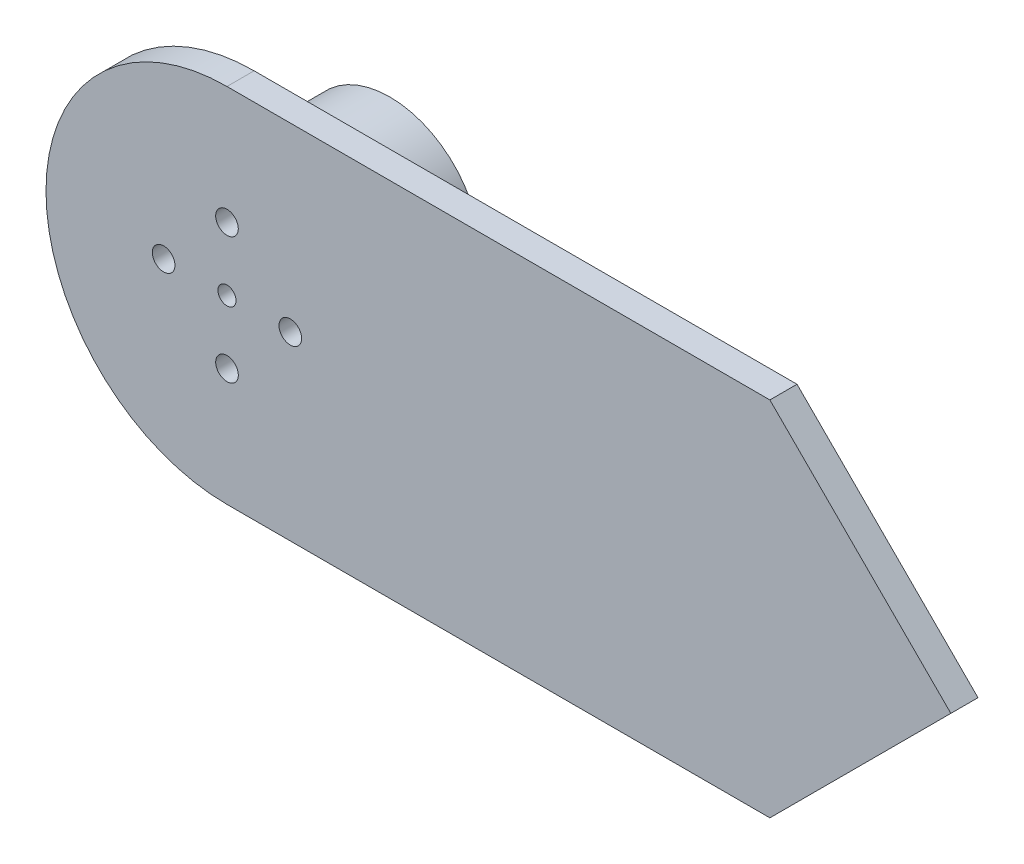
ISO-10303-21;
HEADER;
FILE_DESCRIPTION(('STEP AP214'),'2;1');
FILE_NAME('part.step','',(''),(''),'','','');
FILE_SCHEMA(('AUTOMOTIVE_DESIGN { 1 0 10303 214 1 1 1 1 }'));
ENDSEC;
DATA;
#1=APPLICATION_CONTEXT('core data for automotive mechanical design processes');
#2=APPLICATION_PROTOCOL_DEFINITION('international standard','automotive_design',2000,#1);
#3=PRODUCT_CONTEXT('',#1,'mechanical');
#4=PRODUCT('Part','Part','',(#3));
#5=PRODUCT_RELATED_PRODUCT_CATEGORY('part','',(#4));
#6=PRODUCT_DEFINITION_FORMATION('','',#4);
#7=PRODUCT_DEFINITION_CONTEXT('part definition',#1,'design');
#8=PRODUCT_DEFINITION('design','',#6,#7);
#9=PRODUCT_DEFINITION_SHAPE('','',#8);
#10=(LENGTH_UNIT() NAMED_UNIT(*) SI_UNIT(.MILLI.,.METRE.));
#11=(NAMED_UNIT(*) PLANE_ANGLE_UNIT() SI_UNIT($,.RADIAN.));
#12=(NAMED_UNIT(*) SI_UNIT($,.STERADIAN.) SOLID_ANGLE_UNIT());
#13=UNCERTAINTY_MEASURE_WITH_UNIT(LENGTH_MEASURE(1.E-05),#10,'distance_accuracy_value','');
#14=(GEOMETRIC_REPRESENTATION_CONTEXT(3) GLOBAL_UNCERTAINTY_ASSIGNED_CONTEXT((#13)) GLOBAL_UNIT_ASSIGNED_CONTEXT((#10,
#11,#12)) REPRESENTATION_CONTEXT('',''));
#15=CARTESIAN_POINT('',(0.,0.,0.));
#16=DIRECTION('',(0.,0.,1.));
#17=DIRECTION('',(1.,0.,0.));
#18=AXIS2_PLACEMENT_3D('',#15,#16,#17);
#19=CARTESIAN_POINT('',(0.,0.,0.));
#20=DIRECTION('',(0.,0.,-1.));
#21=DIRECTION('',(0.,1.,0.));
#22=AXIS2_PLACEMENT_3D('',#19,#20,#21);
#23=CYLINDRICAL_SURFACE('',#22,20.);
#24=CARTESIAN_POINT('',(0.,0.,-3.));
#25=DIRECTION('',(0.,0.,1.));
#26=DIRECTION('',(0.,-1.,0.));
#27=AXIS2_PLACEMENT_3D('',#24,#25,#26);
#28=CIRCLE('',#27,20.);
#29=CARTESIAN_POINT('',(0.,20.,-2.99999999999993));
#30=VERTEX_POINT('',#29);
#31=CARTESIAN_POINT('',(0.,-20.,-3.00000000000007));
#32=VERTEX_POINT('',#31);
#33=EDGE_CURVE('E112',#30,#32,#28,.T.);
#34=ORIENTED_EDGE('',*,*,#33,.T.);
#35=DIRECTION('',(0.,0.,-1.));
#36=VECTOR('',#35,1.);
#37=CARTESIAN_POINT('',(0.,-20.,0.));
#38=LINE('',#37,#36);
#39=CARTESIAN_POINT('',(0.,-20.,0.));
#40=VERTEX_POINT('',#39);
#41=EDGE_CURVE('E44',#40,#32,#38,.T.);
#42=ORIENTED_EDGE('',*,*,#41,.F.);
#43=CARTESIAN_POINT('',(0.,0.,0.));
#44=DIRECTION('',(0.,0.,1.));
#45=DIRECTION('',(0.,-1.,0.));
#46=AXIS2_PLACEMENT_3D('',#43,#44,#45);
#47=CIRCLE('',#46,20.);
#48=CARTESIAN_POINT('',(0.,20.,0.));
#49=VERTEX_POINT('',#48);
#50=EDGE_CURVE('E81',#49,#40,#47,.T.);
#51=ORIENTED_EDGE('',*,*,#50,.F.);
#52=DIRECTION('',(0.,0.,-1.));
#53=VECTOR('',#52,1.);
#54=CARTESIAN_POINT('',(0.,20.,0.));
#55=LINE('',#54,#53);
#56=EDGE_CURVE('E52',#49,#30,#55,.T.);
#57=ORIENTED_EDGE('',*,*,#56,.T.);
#58=EDGE_LOOP('',(#34,#42,#51,#57));
#59=FACE_BOUND('',#58,.T.);
#60=ADVANCED_FACE('F36',(#59),#23,.T.);
#61=CARTESIAN_POINT('',(60.,-20.,0.));
#62=DIRECTION('',(0.,-1.,0.));
#63=DIRECTION('',(1.,0.,0.));
#64=AXIS2_PLACEMENT_3D('',#61,#62,#63);
#65=PLANE('',#64);
#66=DIRECTION('',(-1.,0.,0.));
#67=VECTOR('',#66,1.);
#68=CARTESIAN_POINT('',(60.,-20.,-3.00000000000007));
#69=LINE('',#68,#67);
#70=CARTESIAN_POINT('',(60.,-20.,-3.00000000000007));
#71=VERTEX_POINT('',#70);
#72=EDGE_CURVE('E114',#71,#32,#69,.T.);
#73=ORIENTED_EDGE('',*,*,#72,.F.);
#74=DIRECTION('',(0.,0.,-1.));
#75=VECTOR('',#74,1.);
#76=CARTESIAN_POINT('',(60.,-20.,0.));
#77=LINE('',#76,#75);
#78=CARTESIAN_POINT('',(60.,-20.,0.));
#79=VERTEX_POINT('',#78);
#80=EDGE_CURVE('E98',#79,#71,#77,.T.);
#81=ORIENTED_EDGE('',*,*,#80,.F.);
#82=DIRECTION('',(-1.,0.,0.));
#83=VECTOR('',#82,1.);
#84=CARTESIAN_POINT('',(60.,-20.,0.));
#85=LINE('',#84,#83);
#86=EDGE_CURVE('E104',#79,#40,#85,.T.);
#87=ORIENTED_EDGE('',*,*,#86,.T.);
#88=ORIENTED_EDGE('',*,*,#41,.T.);
#89=EDGE_LOOP('',(#73,#81,#87,#88));
#90=FACE_BOUND('',#89,.T.);
#91=ADVANCED_FACE('F128',(#90),#65,.T.);
#92=CARTESIAN_POINT('',(80.,0.,0.));
#93=DIRECTION('',(0.707106781186548,-0.707106781186547,0.));
#94=DIRECTION('',(0.707106781186547,0.707106781186548,0.));
#95=AXIS2_PLACEMENT_3D('',#92,#93,#94);
#96=PLANE('',#95);
#97=DIRECTION('',(-0.707106781186547,-0.707106781186548,0.));
#98=VECTOR('',#97,1.);
#99=CARTESIAN_POINT('',(80.,0.,-3.));
#100=LINE('',#99,#98);
#101=CARTESIAN_POINT('',(80.,0.,-3.));
#102=VERTEX_POINT('',#101);
#103=EDGE_CURVE('E94',#102,#71,#100,.T.);
#104=ORIENTED_EDGE('',*,*,#103,.F.);
#105=DIRECTION('',(0.,0.,-1.));
#106=VECTOR('',#105,1.);
#107=CARTESIAN_POINT('',(80.,0.,0.));
#108=LINE('',#107,#106);
#109=CARTESIAN_POINT('',(80.,0.,0.));
#110=VERTEX_POINT('',#109);
#111=EDGE_CURVE('E89',#110,#102,#108,.T.);
#112=ORIENTED_EDGE('',*,*,#111,.F.);
#113=DIRECTION('',(-0.707106781186547,-0.707106781186548,0.));
#114=VECTOR('',#113,1.);
#115=CARTESIAN_POINT('',(80.,0.,0.));
#116=LINE('',#115,#114);
#117=EDGE_CURVE('E92',#110,#79,#116,.T.);
#118=ORIENTED_EDGE('',*,*,#117,.T.);
#119=ORIENTED_EDGE('',*,*,#80,.T.);
#120=EDGE_LOOP('',(#104,#112,#118,#119));
#121=FACE_BOUND('',#120,.T.);
#122=ADVANCED_FACE('F91',(#121),#96,.T.);
#123=CARTESIAN_POINT('',(60.,20.,0.));
#124=DIRECTION('',(0.707106781186547,0.707106781186548,0.));
#125=DIRECTION('',(-0.707106781186548,0.707106781186547,0.));
#126=AXIS2_PLACEMENT_3D('',#123,#124,#125);
#127=PLANE('',#126);
#128=DIRECTION('',(0.707106781186548,-0.707106781186547,0.));
#129=VECTOR('',#128,1.);
#130=CARTESIAN_POINT('',(60.,20.,-2.99999999999993));
#131=LINE('',#130,#129);
#132=CARTESIAN_POINT('',(60.,20.,-2.99999999999993));
#133=VERTEX_POINT('',#132);
#134=EDGE_CURVE('E119',#133,#102,#131,.T.);
#135=ORIENTED_EDGE('',*,*,#134,.F.);
#136=DIRECTION('',(0.,0.,-1.));
#137=VECTOR('',#136,1.);
#138=CARTESIAN_POINT('',(60.,20.,0.));
#139=LINE('',#138,#137);
#140=CARTESIAN_POINT('',(60.,20.,0.));
#141=VERTEX_POINT('',#140);
#142=EDGE_CURVE('E69',#141,#133,#139,.T.);
#143=ORIENTED_EDGE('',*,*,#142,.F.);
#144=DIRECTION('',(0.707106781186548,-0.707106781186547,0.));
#145=VECTOR('',#144,1.);
#146=CARTESIAN_POINT('',(60.,20.,0.));
#147=LINE('',#146,#145);
#148=EDGE_CURVE('E102',#141,#110,#147,.T.);
#149=ORIENTED_EDGE('',*,*,#148,.T.);
#150=ORIENTED_EDGE('',*,*,#111,.T.);
#151=EDGE_LOOP('',(#135,#143,#149,#150));
#152=FACE_BOUND('',#151,.T.);
#153=ADVANCED_FACE('F106',(#152),#127,.T.);
#154=CARTESIAN_POINT('',(0.,20.,0.));
#155=DIRECTION('',(0.,1.,0.));
#156=DIRECTION('',(-1.,0.,0.));
#157=AXIS2_PLACEMENT_3D('',#154,#155,#156);
#158=PLANE('',#157);
#159=DIRECTION('',(1.,0.,0.));
#160=VECTOR('',#159,1.);
#161=CARTESIAN_POINT('',(0.,20.,-2.99999999999993));
#162=LINE('',#161,#160);
#163=EDGE_CURVE('E121',#30,#133,#162,.T.);
#164=ORIENTED_EDGE('',*,*,#163,.F.);
#165=ORIENTED_EDGE('',*,*,#56,.F.);
#166=DIRECTION('',(1.,0.,0.));
#167=VECTOR('',#166,1.);
#168=CARTESIAN_POINT('',(0.,20.,0.));
#169=LINE('',#168,#167);
#170=EDGE_CURVE('E107',#49,#141,#169,.T.);
#171=ORIENTED_EDGE('',*,*,#170,.T.);
#172=ORIENTED_EDGE('',*,*,#142,.T.);
#173=EDGE_LOOP('',(#164,#165,#171,#172));
#174=FACE_BOUND('',#173,.T.);
#175=ADVANCED_FACE('F131',(#174),#158,.T.);
#176=CARTESIAN_POINT('',(0.,0.,0.));
#177=DIRECTION('',(0.,0.,1.));
#178=DIRECTION('',(0.,-1.,0.));
#179=AXIS2_PLACEMENT_3D('',#176,#177,#178);
#180=PLANE('',#179);
#181=CARTESIAN_POINT('',(0.,6.99999999999999,0.));
#182=DIRECTION('',(0.,0.,1.));
#183=DIRECTION('',(0.,-1.,0.));
#184=AXIS2_PLACEMENT_3D('',#181,#182,#183);
#185=CIRCLE('',#184,1.25);
#186=CARTESIAN_POINT('',(0.,5.74999999999999,0.));
#187=VERTEX_POINT('',#186);
#188=EDGE_CURVE('E115',#187,#187,#185,.T.);
#189=ORIENTED_EDGE('',*,*,#188,.F.);
#190=EDGE_LOOP('',(#189));
#191=FACE_BOUND('',#190,.T.);
#192=CARTESIAN_POINT('',(-6.999,-0.00100000000001176,0.));
#193=DIRECTION('',(0.,0.,1.));
#194=DIRECTION('',(0.,-1.,0.));
#195=AXIS2_PLACEMENT_3D('',#192,#193,#194);
#196=CIRCLE('',#195,1.25);
#197=CARTESIAN_POINT('',(-6.999,-1.25100000000001,0.));
#198=VERTEX_POINT('',#197);
#199=EDGE_CURVE('E319',#198,#198,#196,.T.);
#200=ORIENTED_EDGE('',*,*,#199,.F.);
#201=EDGE_LOOP('',(#200));
#202=FACE_BOUND('',#201,.T.);
#203=CARTESIAN_POINT('',(0.00200000000000086,-7.00000000000001,0.));
#204=DIRECTION('',(0.,0.,1.));
#205=DIRECTION('',(0.,-1.,0.));
#206=AXIS2_PLACEMENT_3D('',#203,#204,#205);
#207=CIRCLE('',#206,1.25);
#208=CARTESIAN_POINT('',(0.00200000000000086,-8.25000000000001,0.));
#209=VERTEX_POINT('',#208);
#210=EDGE_CURVE('E323',#209,#209,#207,.T.);
#211=ORIENTED_EDGE('',*,*,#210,.F.);
#212=EDGE_LOOP('',(#211));
#213=FACE_BOUND('',#212,.T.);
#214=CARTESIAN_POINT('',(7.001,0.000999999999989954,0.));
#215=DIRECTION('',(0.,0.,1.));
#216=DIRECTION('',(0.,-1.,0.));
#217=AXIS2_PLACEMENT_3D('',#214,#215,#216);
#218=CIRCLE('',#217,1.25);
#219=CARTESIAN_POINT('',(7.001,-1.24900000000001,0.));
#220=VERTEX_POINT('',#219);
#221=EDGE_CURVE('E326',#220,#220,#218,.T.);
#222=ORIENTED_EDGE('',*,*,#221,.F.);
#223=EDGE_LOOP('',(#222));
#224=FACE_BOUND('',#223,.T.);
#225=CARTESIAN_POINT('',(0.,0.,0.));
#226=DIRECTION('',(0.,0.,1.));
#227=DIRECTION('',(0.,-1.,0.));
#228=AXIS2_PLACEMENT_3D('',#225,#226,#227);
#229=CIRCLE('',#228,1.);
#230=CARTESIAN_POINT('',(0.,-1.00000000000001,0.));
#231=VERTEX_POINT('',#230);
#232=EDGE_CURVE('E322',#231,#231,#229,.T.);
#233=ORIENTED_EDGE('',*,*,#232,.F.);
#234=EDGE_LOOP('',(#233));
#235=FACE_BOUND('',#234,.T.);
#236=ORIENTED_EDGE('',*,*,#50,.T.);
#237=ORIENTED_EDGE('',*,*,#86,.F.);
#238=ORIENTED_EDGE('',*,*,#117,.F.);
#239=ORIENTED_EDGE('',*,*,#148,.F.);
#240=ORIENTED_EDGE('',*,*,#170,.F.);
#241=EDGE_LOOP('',(#236,#237,#238,#239,#240));
#242=FACE_BOUND('',#241,.T.);
#243=ADVANCED_FACE('F101',(#191,#202,#213,#224,#235,#242),#180,.T.);
#244=CARTESIAN_POINT('',(0.,0.,-3.));
#245=DIRECTION('',(0.,0.,1.));
#246=DIRECTION('',(0.,-1.,0.));
#247=AXIS2_PLACEMENT_3D('',#244,#245,#246);
#248=PLANE('',#247);
#249=CARTESIAN_POINT('',(0.,0.,-3.));
#250=DIRECTION('',(0.,0.,1.));
#251=DIRECTION('',(0.,-1.,0.));
#252=AXIS2_PLACEMENT_3D('',#249,#250,#251);
#253=CIRCLE('',#252,10.);
#254=CARTESIAN_POINT('',(0.,-10.,-3.00000000000004));
#255=VERTEX_POINT('',#254);
#256=EDGE_CURVE('E11',#255,#255,#253,.F.);
#257=ORIENTED_EDGE('',*,*,#256,.F.);
#258=EDGE_LOOP('',(#257));
#259=FACE_BOUND('',#258,.T.);
#260=ORIENTED_EDGE('',*,*,#33,.F.);
#261=ORIENTED_EDGE('',*,*,#163,.T.);
#262=ORIENTED_EDGE('',*,*,#134,.T.);
#263=ORIENTED_EDGE('',*,*,#103,.T.);
#264=ORIENTED_EDGE('',*,*,#72,.T.);
#265=EDGE_LOOP('',(#260,#261,#262,#263,#264));
#266=FACE_BOUND('',#265,.T.);
#267=ADVANCED_FACE('F130',(#259,#266),#248,.F.);
#268=CARTESIAN_POINT('',(0.,0.,-3.001));
#269=DIRECTION('',(0.,0.,1.));
#270=DIRECTION('',(0.,-1.,0.));
#271=AXIS2_PLACEMENT_3D('',#268,#269,#270);
#272=CYLINDRICAL_SURFACE('',#271,1.);
#273=CARTESIAN_POINT('',(0.,0.,-3.));
#274=DIRECTION('',(0.,0.,-1.));
#275=DIRECTION('',(0.,1.,0.));
#276=AXIS2_PLACEMENT_3D('',#273,#274,#275);
#277=CIRCLE('',#276,1.);
#278=CARTESIAN_POINT('',(0.,-1.,-3.));
#279=VERTEX_POINT('',#278);
#280=EDGE_CURVE('E316',#279,#279,#277,.F.);
#281=CARTESIAN_POINT('',(0.,-1.00000000000001,0.));
#282=CARTESIAN_POINT('',(0.,-1.00000000000001,-0.0312500000000039));
#283=CARTESIAN_POINT('',(0.,-1.00000000000001,-0.062500000000004));
#284=CARTESIAN_POINT('',(0.,-1.00000000000001,-0.125000000000004));
#285=CARTESIAN_POINT('',(0.,-1.00000000000001,-0.156250000000004));
#286=CARTESIAN_POINT('',(0.,-1.00000000000001,-0.218750000000004));
#287=CARTESIAN_POINT('',(0.,-1.00000000000001,-0.250000000000004));
#288=CARTESIAN_POINT('',(0.,-1.00000000000001,-0.312500000000004));
#289=CARTESIAN_POINT('',(0.,-1.00000000000001,-0.343750000000004));
#290=CARTESIAN_POINT('',(0.,-1.00000000000001,-0.406250000000004));
#291=CARTESIAN_POINT('',(0.,-1.00000000000001,-0.437500000000004));
#292=CARTESIAN_POINT('',(0.,-1.00000000000001,-0.500000000000004));
#293=CARTESIAN_POINT('',(0.,-1.00000000000001,-0.531250000000004));
#294=CARTESIAN_POINT('',(0.,-1.00000000000001,-0.593750000000004));
#295=CARTESIAN_POINT('',(0.,-1.00000000000001,-0.625000000000004));
#296=CARTESIAN_POINT('',(0.,-1.00000000000001,-0.687500000000004));
#297=CARTESIAN_POINT('',(0.,-1.00000000000001,-0.718750000000004));
#298=CARTESIAN_POINT('',(0.,-1.00000000000001,-0.781250000000004));
#299=CARTESIAN_POINT('',(0.,-1.00000000000001,-0.812500000000004));
#300=CARTESIAN_POINT('',(0.,-1.00000000000001,-0.875000000000004));
#301=CARTESIAN_POINT('',(0.,-1.00000000000001,-0.906250000000004));
#302=CARTESIAN_POINT('',(0.,-1.00000000000001,-0.968750000000004));
#303=CARTESIAN_POINT('',(0.,-1.00000000000001,-1.));
#304=CARTESIAN_POINT('',(0.,-1.00000000000001,-1.0625));
#305=CARTESIAN_POINT('',(0.,-1.00000000000001,-1.09375));
#306=CARTESIAN_POINT('',(0.,-1.00000000000001,-1.15625));
#307=CARTESIAN_POINT('',(0.,-1.00000000000001,-1.1875));
#308=CARTESIAN_POINT('',(0.,-1.00000000000001,-1.25));
#309=CARTESIAN_POINT('',(0.,-1.00000000000001,-1.28125));
#310=CARTESIAN_POINT('',(0.,-1.00000000000001,-1.34375));
#311=CARTESIAN_POINT('',(0.,-1.00000000000001,-1.375));
#312=CARTESIAN_POINT('',(0.,-1.00000000000001,-1.4375));
#313=CARTESIAN_POINT('',(0.,-1.00000000000001,-1.46875));
#314=CARTESIAN_POINT('',(0.,-1.00000000000001,-1.53125));
#315=CARTESIAN_POINT('',(0.,-1.00000000000001,-1.5625));
#316=CARTESIAN_POINT('',(0.,-1.00000000000001,-1.625));
#317=CARTESIAN_POINT('',(0.,-1.,-1.65625));
#318=CARTESIAN_POINT('',(0.,-1.,-1.71875));
#319=CARTESIAN_POINT('',(0.,-1.,-1.75));
#320=CARTESIAN_POINT('',(0.,-1.,-1.8125));
#321=CARTESIAN_POINT('',(0.,-1.,-1.84375));
#322=CARTESIAN_POINT('',(0.,-1.,-1.90625));
#323=CARTESIAN_POINT('',(0.,-1.,-1.9375));
#324=CARTESIAN_POINT('',(0.,-1.,-2.));
#325=CARTESIAN_POINT('',(0.,-1.,-2.03125));
#326=CARTESIAN_POINT('',(0.,-1.,-2.09375));
#327=CARTESIAN_POINT('',(0.,-1.,-2.125));
#328=CARTESIAN_POINT('',(0.,-1.,-2.1875));
#329=CARTESIAN_POINT('',(0.,-1.,-2.21875));
#330=CARTESIAN_POINT('',(0.,-1.,-2.28125));
#331=CARTESIAN_POINT('',(0.,-1.,-2.3125));
#332=CARTESIAN_POINT('',(0.,-1.,-2.375));
#333=CARTESIAN_POINT('',(0.,-1.,-2.40625));
#334=CARTESIAN_POINT('',(0.,-1.,-2.46875));
#335=CARTESIAN_POINT('',(0.,-1.,-2.5));
#336=CARTESIAN_POINT('',(0.,-1.,-2.5625));
#337=CARTESIAN_POINT('',(0.,-1.,-2.59375));
#338=CARTESIAN_POINT('',(0.,-1.,-2.65625));
#339=CARTESIAN_POINT('',(0.,-1.,-2.6875));
#340=CARTESIAN_POINT('',(0.,-1.,-2.75));
#341=CARTESIAN_POINT('',(0.,-1.,-2.78125));
#342=CARTESIAN_POINT('',(0.,-1.,-2.84375));
#343=CARTESIAN_POINT('',(0.,-1.,-2.875));
#344=CARTESIAN_POINT('',(0.,-1.,-2.9375));
#345=CARTESIAN_POINT('',(0.,-1.,-2.96875));
#346=CARTESIAN_POINT('',(0.,-1.,-3.));
#347=B_SPLINE_CURVE_WITH_KNOTS('',3,(#281,#282,#283,#284,#285,#286,#287,#288,#289,#290,#291,
#292,#293,#294,#295,#296,#297,#298,#299,#300,#301,#302,#303,#304,#305,#306,#307,#308,#309,#310,
#311,#312,#313,#314,#315,#316,#317,#318,#319,#320,#321,#322,#323,#324,#325,#326,#327,#328,#329,
#330,#331,#332,#333,#334,#335,#336,#337,#338,#339,#340,#341,#342,#343,#344,#345,#346),
.UNSPECIFIED.,.F.,.F.,(4,2,2,2,2,2,2,2,2,2,2,2,2,2,2,2,2,2,2,2,2,2,2,2,2,2,2,2,2,2,2,2,4),(0.,
0.0937500000000001,0.1875,0.28125,0.375,0.46875,0.5625,0.65625,0.75,0.84375,0.9375,1.03125,
1.125,1.21875,1.3125,1.40625,1.5,1.59375,1.6875,1.78125,1.875,1.96875,2.0625,2.15625,2.25,
2.34375,2.4375,2.53125,2.625,2.71875,2.8125,2.90625,3.),.UNSPECIFIED.);
#348=EDGE_CURVE('BSEAM180',#231,#279,#347,.T.);
#349=ORIENTED_EDGE('',*,*,#232,.T.);
#350=ORIENTED_EDGE('',*,*,#280,.F.);
#351=ORIENTED_EDGE('',*,*,#348,.T.);
#352=ORIENTED_EDGE('',*,*,#348,.F.);
#353=EDGE_LOOP('',(#349,#351,#350,#352));
#354=FACE_BOUND('',#353,.T.);
#355=ADVANCED_FACE('F180',(#354),#272,.F.);
#356=CARTESIAN_POINT('',(7.001,0.00100000000000043,-3.001));
#357=DIRECTION('',(0.,0.,1.));
#358=DIRECTION('',(0.,-1.,0.));
#359=AXIS2_PLACEMENT_3D('',#356,#357,#358);
#360=CYLINDRICAL_SURFACE('',#359,1.25);
#361=CARTESIAN_POINT('',(7.001,0.00100000000000043,-3.));
#362=DIRECTION('',(0.,0.,-1.));
#363=DIRECTION('',(0.,1.,0.));
#364=AXIS2_PLACEMENT_3D('',#361,#362,#363);
#365=CIRCLE('',#364,1.25);
#366=CARTESIAN_POINT('',(7.001,-1.249,-3.));
#367=VERTEX_POINT('',#366);
#368=EDGE_CURVE('E313',#367,#367,#365,.F.);
#369=CARTESIAN_POINT('',(7.001,-1.24900000000001,0.));
#370=CARTESIAN_POINT('',(7.001,-1.24900000000001,-0.0312500000000048));
#371=CARTESIAN_POINT('',(7.001,-1.24900000000001,-0.0625000000000048));
#372=CARTESIAN_POINT('',(7.001,-1.24900000000001,-0.125000000000005));
#373=CARTESIAN_POINT('',(7.001,-1.24900000000001,-0.156250000000005));
#374=CARTESIAN_POINT('',(7.001,-1.24900000000001,-0.218750000000005));
#375=CARTESIAN_POINT('',(7.001,-1.24900000000001,-0.250000000000005));
#376=CARTESIAN_POINT('',(7.001,-1.24900000000001,-0.312500000000005));
#377=CARTESIAN_POINT('',(7.001,-1.24900000000001,-0.343750000000005));
#378=CARTESIAN_POINT('',(7.001,-1.24900000000001,-0.406250000000005));
#379=CARTESIAN_POINT('',(7.001,-1.24900000000001,-0.437500000000005));
#380=CARTESIAN_POINT('',(7.001,-1.24900000000001,-0.500000000000005));
#381=CARTESIAN_POINT('',(7.001,-1.24900000000001,-0.531250000000005));
#382=CARTESIAN_POINT('',(7.001,-1.24900000000001,-0.593750000000005));
#383=CARTESIAN_POINT('',(7.001,-1.24900000000001,-0.625000000000005));
#384=CARTESIAN_POINT('',(7.001,-1.24900000000001,-0.687500000000005));
#385=CARTESIAN_POINT('',(7.001,-1.24900000000001,-0.718750000000005));
#386=CARTESIAN_POINT('',(7.001,-1.24900000000001,-0.781250000000005));
#387=CARTESIAN_POINT('',(7.001,-1.24900000000001,-0.812500000000005));
#388=CARTESIAN_POINT('',(7.001,-1.24900000000001,-0.875000000000005));
#389=CARTESIAN_POINT('',(7.001,-1.24900000000001,-0.906250000000005));
#390=CARTESIAN_POINT('',(7.001,-1.24900000000001,-0.968750000000005));
#391=CARTESIAN_POINT('',(7.001,-1.24900000000001,-1.));
#392=CARTESIAN_POINT('',(7.001,-1.24900000000001,-1.0625));
#393=CARTESIAN_POINT('',(7.001,-1.24900000000001,-1.09375));
#394=CARTESIAN_POINT('',(7.001,-1.24900000000001,-1.15625));
#395=CARTESIAN_POINT('',(7.001,-1.24900000000001,-1.1875));
#396=CARTESIAN_POINT('',(7.001,-1.24900000000001,-1.25));
#397=CARTESIAN_POINT('',(7.001,-1.24900000000001,-1.28125));
#398=CARTESIAN_POINT('',(7.001,-1.24900000000001,-1.34375));
#399=CARTESIAN_POINT('',(7.001,-1.24900000000001,-1.375));
#400=CARTESIAN_POINT('',(7.001,-1.24900000000001,-1.4375));
#401=CARTESIAN_POINT('',(7.001,-1.24900000000001,-1.46875));
#402=CARTESIAN_POINT('',(7.001,-1.24900000000001,-1.53125));
#403=CARTESIAN_POINT('',(7.001,-1.24900000000001,-1.5625));
#404=CARTESIAN_POINT('',(7.001,-1.24900000000001,-1.625));
#405=CARTESIAN_POINT('',(7.001,-1.24900000000001,-1.65625));
#406=CARTESIAN_POINT('',(7.001,-1.249,-1.71875));
#407=CARTESIAN_POINT('',(7.001,-1.249,-1.75));
#408=CARTESIAN_POINT('',(7.001,-1.249,-1.8125));
#409=CARTESIAN_POINT('',(7.001,-1.249,-1.84375));
#410=CARTESIAN_POINT('',(7.001,-1.249,-1.90625));
#411=CARTESIAN_POINT('',(7.001,-1.249,-1.9375));
#412=CARTESIAN_POINT('',(7.001,-1.249,-2.));
#413=CARTESIAN_POINT('',(7.001,-1.249,-2.03125));
#414=CARTESIAN_POINT('',(7.001,-1.249,-2.09375));
#415=CARTESIAN_POINT('',(7.001,-1.249,-2.125));
#416=CARTESIAN_POINT('',(7.001,-1.249,-2.1875));
#417=CARTESIAN_POINT('',(7.001,-1.249,-2.21875));
#418=CARTESIAN_POINT('',(7.001,-1.249,-2.28125));
#419=CARTESIAN_POINT('',(7.001,-1.249,-2.3125));
#420=CARTESIAN_POINT('',(7.001,-1.249,-2.375));
#421=CARTESIAN_POINT('',(7.001,-1.249,-2.40625));
#422=CARTESIAN_POINT('',(7.001,-1.249,-2.46875));
#423=CARTESIAN_POINT('',(7.001,-1.249,-2.5));
#424=CARTESIAN_POINT('',(7.001,-1.249,-2.5625));
#425=CARTESIAN_POINT('',(7.001,-1.249,-2.59375));
#426=CARTESIAN_POINT('',(7.001,-1.249,-2.65625));
#427=CARTESIAN_POINT('',(7.001,-1.249,-2.6875));
#428=CARTESIAN_POINT('',(7.001,-1.249,-2.75));
#429=CARTESIAN_POINT('',(7.001,-1.249,-2.78125));
#430=CARTESIAN_POINT('',(7.001,-1.249,-2.84375));
#431=CARTESIAN_POINT('',(7.001,-1.249,-2.875));
#432=CARTESIAN_POINT('',(7.001,-1.249,-2.9375));
#433=CARTESIAN_POINT('',(7.001,-1.249,-2.96875));
#434=CARTESIAN_POINT('',(7.001,-1.249,-3.));
#435=B_SPLINE_CURVE_WITH_KNOTS('',3,(#369,#370,#371,#372,#373,#374,#375,#376,#377,#378,#379,
#380,#381,#382,#383,#384,#385,#386,#387,#388,#389,#390,#391,#392,#393,#394,#395,#396,#397,#398,
#399,#400,#401,#402,#403,#404,#405,#406,#407,#408,#409,#410,#411,#412,#413,#414,#415,#416,#417,
#418,#419,#420,#421,#422,#423,#424,#425,#426,#427,#428,#429,#430,#431,#432,#433,#434),
.UNSPECIFIED.,.F.,.F.,(4,2,2,2,2,2,2,2,2,2,2,2,2,2,2,2,2,2,2,2,2,2,2,2,2,2,2,2,2,2,2,2,4),(0.,
0.0937500000000001,0.1875,0.28125,0.375,0.46875,0.5625,0.65625,0.75,0.84375,0.9375,1.03125,
1.125,1.21875,1.3125,1.40625,1.5,1.59375,1.6875,1.78125,1.875,1.96875,2.0625,2.15625,2.25,
2.34375,2.4375,2.53125,2.625,2.71875,2.8125,2.90625,3.),.UNSPECIFIED.);
#436=EDGE_CURVE('BSEAM189',#220,#367,#435,.T.);
#437=ORIENTED_EDGE('',*,*,#221,.T.);
#438=ORIENTED_EDGE('',*,*,#368,.F.);
#439=ORIENTED_EDGE('',*,*,#436,.T.);
#440=ORIENTED_EDGE('',*,*,#436,.F.);
#441=EDGE_LOOP('',(#437,#439,#438,#440));
#442=FACE_BOUND('',#441,.T.);
#443=ADVANCED_FACE('F189',(#442),#360,.F.);
#444=CARTESIAN_POINT('',(0.00200000000000086,-7.,-3.00100000000002));
#445=DIRECTION('',(0.,0.,1.));
#446=DIRECTION('',(0.,-1.,0.));
#447=AXIS2_PLACEMENT_3D('',#444,#445,#446);
#448=CYLINDRICAL_SURFACE('',#447,1.25);
#449=CARTESIAN_POINT('',(0.00200000000000086,-7.,-3.00000000000002));
#450=DIRECTION('',(0.,0.,-1.));
#451=DIRECTION('',(0.,1.,0.));
#452=AXIS2_PLACEMENT_3D('',#449,#450,#451);
#453=CIRCLE('',#452,1.25);
#454=CARTESIAN_POINT('',(0.00200000000000086,-8.25,-3.00000000000003));
#455=VERTEX_POINT('',#454);
#456=EDGE_CURVE('E310',#455,#455,#453,.F.);
#457=CARTESIAN_POINT('',(0.00200000000000086,-8.25000000000001,0.));
#458=CARTESIAN_POINT('',(0.00200000000000086,-8.25000000000001,-0.0312500000000291));
#459=CARTESIAN_POINT('',(0.00200000000000086,-8.25000000000001,-0.0625000000000291));
#460=CARTESIAN_POINT('',(0.00200000000000086,-8.25000000000001,-0.125000000000029));
#461=CARTESIAN_POINT('',(0.00200000000000086,-8.25000000000001,-0.156250000000029));
#462=CARTESIAN_POINT('',(0.00200000000000086,-8.25000000000001,-0.218750000000029));
#463=CARTESIAN_POINT('',(0.00200000000000086,-8.25000000000001,-0.250000000000029));
#464=CARTESIAN_POINT('',(0.00200000000000086,-8.25000000000001,-0.312500000000029));
#465=CARTESIAN_POINT('',(0.00200000000000086,-8.25000000000001,-0.343750000000029));
#466=CARTESIAN_POINT('',(0.00200000000000086,-8.25000000000001,-0.406250000000029));
#467=CARTESIAN_POINT('',(0.00200000000000086,-8.25000000000001,-0.437500000000029));
#468=CARTESIAN_POINT('',(0.00200000000000086,-8.25000000000001,-0.500000000000029));
#469=CARTESIAN_POINT('',(0.00200000000000086,-8.25000000000001,-0.531250000000029));
#470=CARTESIAN_POINT('',(0.00200000000000086,-8.25000000000001,-0.593750000000029));
#471=CARTESIAN_POINT('',(0.00200000000000086,-8.25000000000001,-0.625000000000029));
#472=CARTESIAN_POINT('',(0.00200000000000086,-8.25000000000001,-0.687500000000029));
#473=CARTESIAN_POINT('',(0.00200000000000086,-8.25000000000001,-0.718750000000029));
#474=CARTESIAN_POINT('',(0.00200000000000086,-8.25000000000001,-0.781250000000029));
#475=CARTESIAN_POINT('',(0.00200000000000086,-8.25000000000001,-0.812500000000029));
#476=CARTESIAN_POINT('',(0.00200000000000086,-8.25000000000001,-0.875000000000029));
#477=CARTESIAN_POINT('',(0.00200000000000086,-8.25000000000001,-0.906250000000029));
#478=CARTESIAN_POINT('',(0.00200000000000086,-8.25000000000001,-0.968750000000029));
#479=CARTESIAN_POINT('',(0.00200000000000086,-8.25000000000001,-1.00000000000003));
#480=CARTESIAN_POINT('',(0.00200000000000086,-8.25000000000001,-1.06250000000003));
#481=CARTESIAN_POINT('',(0.00200000000000086,-8.25000000000001,-1.09375000000003));
#482=CARTESIAN_POINT('',(0.00200000000000086,-8.25000000000001,-1.15625000000003));
#483=CARTESIAN_POINT('',(0.00200000000000086,-8.25000000000001,-1.18750000000003));
#484=CARTESIAN_POINT('',(0.00200000000000086,-8.25000000000001,-1.25000000000003));
#485=CARTESIAN_POINT('',(0.00200000000000086,-8.25000000000001,-1.28125000000003));
#486=CARTESIAN_POINT('',(0.00200000000000086,-8.25000000000001,-1.34375000000003));
#487=CARTESIAN_POINT('',(0.00200000000000086,-8.25000000000001,-1.37500000000003));
#488=CARTESIAN_POINT('',(0.00200000000000086,-8.25000000000001,-1.43750000000003));
#489=CARTESIAN_POINT('',(0.00200000000000086,-8.25000000000001,-1.46875000000003));
#490=CARTESIAN_POINT('',(0.00200000000000086,-8.25000000000001,-1.53125000000003));
#491=CARTESIAN_POINT('',(0.00200000000000086,-8.25000000000001,-1.56250000000003));
#492=CARTESIAN_POINT('',(0.00200000000000086,-8.25000000000001,-1.62500000000003));
#493=CARTESIAN_POINT('',(0.00200000000000086,-8.25000000000001,-1.65625000000003));
#494=CARTESIAN_POINT('',(0.00200000000000086,-8.25000000000001,-1.71875000000003));
#495=CARTESIAN_POINT('',(0.00200000000000086,-8.25,-1.75000000000003));
#496=CARTESIAN_POINT('',(0.00200000000000086,-8.25,-1.81250000000003));
#497=CARTESIAN_POINT('',(0.00200000000000086,-8.25,-1.84375000000003));
#498=CARTESIAN_POINT('',(0.00200000000000086,-8.25,-1.90625000000003));
#499=CARTESIAN_POINT('',(0.00200000000000086,-8.25,-1.93750000000003));
#500=CARTESIAN_POINT('',(0.00200000000000086,-8.25,-2.00000000000003));
#501=CARTESIAN_POINT('',(0.00200000000000086,-8.25,-2.03125000000003));
#502=CARTESIAN_POINT('',(0.00200000000000086,-8.25,-2.09375000000003));
#503=CARTESIAN_POINT('',(0.00200000000000086,-8.25,-2.12500000000003));
#504=CARTESIAN_POINT('',(0.00200000000000086,-8.25,-2.18750000000003));
#505=CARTESIAN_POINT('',(0.00200000000000086,-8.25,-2.21875000000003));
#506=CARTESIAN_POINT('',(0.00200000000000086,-8.25,-2.28125000000003));
#507=CARTESIAN_POINT('',(0.00200000000000086,-8.25,-2.31250000000003));
#508=CARTESIAN_POINT('',(0.00200000000000086,-8.25,-2.37500000000003));
#509=CARTESIAN_POINT('',(0.00200000000000086,-8.25,-2.40625000000003));
#510=CARTESIAN_POINT('',(0.00200000000000086,-8.25,-2.46875000000003));
#511=CARTESIAN_POINT('',(0.00200000000000086,-8.25,-2.50000000000003));
#512=CARTESIAN_POINT('',(0.00200000000000086,-8.25,-2.56250000000003));
#513=CARTESIAN_POINT('',(0.00200000000000086,-8.25,-2.59375000000003));
#514=CARTESIAN_POINT('',(0.00200000000000086,-8.25,-2.65625000000003));
#515=CARTESIAN_POINT('',(0.00200000000000086,-8.25,-2.68750000000003));
#516=CARTESIAN_POINT('',(0.00200000000000086,-8.25,-2.75000000000003));
#517=CARTESIAN_POINT('',(0.00200000000000086,-8.25,-2.78125000000003));
#518=CARTESIAN_POINT('',(0.00200000000000086,-8.25,-2.84375000000003));
#519=CARTESIAN_POINT('',(0.00200000000000086,-8.25,-2.87500000000003));
#520=CARTESIAN_POINT('',(0.00200000000000086,-8.25,-2.93750000000003));
#521=CARTESIAN_POINT('',(0.00200000000000086,-8.25,-2.96875000000003));
#522=CARTESIAN_POINT('',(0.00200000000000086,-8.25,-3.00000000000003));
#523=B_SPLINE_CURVE_WITH_KNOTS('',3,(#457,#458,#459,#460,#461,#462,#463,#464,#465,#466,#467,
#468,#469,#470,#471,#472,#473,#474,#475,#476,#477,#478,#479,#480,#481,#482,#483,#484,#485,#486,
#487,#488,#489,#490,#491,#492,#493,#494,#495,#496,#497,#498,#499,#500,#501,#502,#503,#504,#505,
#506,#507,#508,#509,#510,#511,#512,#513,#514,#515,#516,#517,#518,#519,#520,#521,#522),
.UNSPECIFIED.,.F.,.F.,(4,2,2,2,2,2,2,2,2,2,2,2,2,2,2,2,2,2,2,2,2,2,2,2,2,2,2,2,2,2,2,2,4),(0.,
0.0937500000000001,0.1875,0.28125,0.375,0.46875,0.5625,0.65625,0.75,0.84375,0.9375,1.03125,
1.125,1.21875,1.3125,1.40625,1.5,1.59375,1.6875,1.78125,1.875,1.96875,2.0625,2.15625,2.25,
2.34375,2.4375,2.53125,2.625,2.71875,2.8125,2.90625,3.),.UNSPECIFIED.);
#524=EDGE_CURVE('BSEAM199',#209,#455,#523,.T.);
#525=ORIENTED_EDGE('',*,*,#210,.T.);
#526=ORIENTED_EDGE('',*,*,#456,.F.);
#527=ORIENTED_EDGE('',*,*,#524,.T.);
#528=ORIENTED_EDGE('',*,*,#524,.F.);
#529=EDGE_LOOP('',(#525,#527,#526,#528));
#530=FACE_BOUND('',#529,.T.);
#531=ADVANCED_FACE('F199',(#530),#448,.F.);
#532=CARTESIAN_POINT('',(-6.999,-0.00100000000000128,-3.001));
#533=DIRECTION('',(0.,0.,1.));
#534=DIRECTION('',(0.,-1.,0.));
#535=AXIS2_PLACEMENT_3D('',#532,#533,#534);
#536=CYLINDRICAL_SURFACE('',#535,1.25);
#537=CARTESIAN_POINT('',(-6.999,-0.00100000000000129,-3.));
#538=DIRECTION('',(0.,0.,-1.));
#539=DIRECTION('',(0.,1.,0.));
#540=AXIS2_PLACEMENT_3D('',#537,#538,#539);
#541=CIRCLE('',#540,1.25);
#542=CARTESIAN_POINT('',(-6.999,-1.251,-3.));
#543=VERTEX_POINT('',#542);
#544=EDGE_CURVE('E305',#543,#543,#541,.F.);
#545=CARTESIAN_POINT('',(-6.999,-1.25100000000001,0.));
#546=CARTESIAN_POINT('',(-6.999,-1.25100000000001,-0.0312500000000048));
#547=CARTESIAN_POINT('',(-6.999,-1.25100000000001,-0.0625000000000048));
#548=CARTESIAN_POINT('',(-6.999,-1.25100000000001,-0.125000000000005));
#549=CARTESIAN_POINT('',(-6.999,-1.25100000000001,-0.156250000000005));
#550=CARTESIAN_POINT('',(-6.999,-1.25100000000001,-0.218750000000005));
#551=CARTESIAN_POINT('',(-6.999,-1.25100000000001,-0.250000000000005));
#552=CARTESIAN_POINT('',(-6.999,-1.25100000000001,-0.312500000000005));
#553=CARTESIAN_POINT('',(-6.999,-1.25100000000001,-0.343750000000005));
#554=CARTESIAN_POINT('',(-6.999,-1.25100000000001,-0.406250000000005));
#555=CARTESIAN_POINT('',(-6.999,-1.25100000000001,-0.437500000000005));
#556=CARTESIAN_POINT('',(-6.999,-1.25100000000001,-0.500000000000005));
#557=CARTESIAN_POINT('',(-6.999,-1.25100000000001,-0.531250000000005));
#558=CARTESIAN_POINT('',(-6.999,-1.25100000000001,-0.593750000000005));
#559=CARTESIAN_POINT('',(-6.999,-1.25100000000001,-0.625000000000005));
#560=CARTESIAN_POINT('',(-6.999,-1.25100000000001,-0.687500000000005));
#561=CARTESIAN_POINT('',(-6.999,-1.25100000000001,-0.718750000000005));
#562=CARTESIAN_POINT('',(-6.999,-1.25100000000001,-0.781250000000005));
#563=CARTESIAN_POINT('',(-6.999,-1.25100000000001,-0.812500000000005));
#564=CARTESIAN_POINT('',(-6.999,-1.25100000000001,-0.875000000000005));
#565=CARTESIAN_POINT('',(-6.999,-1.25100000000001,-0.906250000000005));
#566=CARTESIAN_POINT('',(-6.999,-1.25100000000001,-0.968750000000005));
#567=CARTESIAN_POINT('',(-6.999,-1.25100000000001,-1.));
#568=CARTESIAN_POINT('',(-6.999,-1.25100000000001,-1.0625));
#569=CARTESIAN_POINT('',(-6.999,-1.25100000000001,-1.09375));
#570=CARTESIAN_POINT('',(-6.999,-1.25100000000001,-1.15625));
#571=CARTESIAN_POINT('',(-6.999,-1.25100000000001,-1.1875));
#572=CARTESIAN_POINT('',(-6.999,-1.25100000000001,-1.25));
#573=CARTESIAN_POINT('',(-6.999,-1.25100000000001,-1.28125));
#574=CARTESIAN_POINT('',(-6.999,-1.25100000000001,-1.34375));
#575=CARTESIAN_POINT('',(-6.999,-1.25100000000001,-1.375));
#576=CARTESIAN_POINT('',(-6.999,-1.25100000000001,-1.4375));
#577=CARTESIAN_POINT('',(-6.999,-1.25100000000001,-1.46875));
#578=CARTESIAN_POINT('',(-6.999,-1.25100000000001,-1.53125));
#579=CARTESIAN_POINT('',(-6.999,-1.25100000000001,-1.5625));
#580=CARTESIAN_POINT('',(-6.999,-1.25100000000001,-1.625));
#581=CARTESIAN_POINT('',(-6.999,-1.25100000000001,-1.65625));
#582=CARTESIAN_POINT('',(-6.999,-1.25100000000001,-1.71875));
#583=CARTESIAN_POINT('',(-6.999,-1.25100000000001,-1.75));
#584=CARTESIAN_POINT('',(-6.999,-1.25100000000001,-1.8125));
#585=CARTESIAN_POINT('',(-6.999,-1.25100000000001,-1.84375));
#586=CARTESIAN_POINT('',(-6.999,-1.251,-1.90625));
#587=CARTESIAN_POINT('',(-6.999,-1.251,-1.9375));
#588=CARTESIAN_POINT('',(-6.999,-1.251,-2.));
#589=CARTESIAN_POINT('',(-6.999,-1.251,-2.03125));
#590=CARTESIAN_POINT('',(-6.999,-1.251,-2.09375));
#591=CARTESIAN_POINT('',(-6.999,-1.251,-2.125));
#592=CARTESIAN_POINT('',(-6.999,-1.251,-2.1875));
#593=CARTESIAN_POINT('',(-6.999,-1.251,-2.21875));
#594=CARTESIAN_POINT('',(-6.999,-1.251,-2.28125));
#595=CARTESIAN_POINT('',(-6.999,-1.251,-2.3125));
#596=CARTESIAN_POINT('',(-6.999,-1.251,-2.375));
#597=CARTESIAN_POINT('',(-6.999,-1.251,-2.40625));
#598=CARTESIAN_POINT('',(-6.999,-1.251,-2.46875));
#599=CARTESIAN_POINT('',(-6.999,-1.251,-2.5));
#600=CARTESIAN_POINT('',(-6.999,-1.251,-2.5625));
#601=CARTESIAN_POINT('',(-6.999,-1.251,-2.59375));
#602=CARTESIAN_POINT('',(-6.999,-1.251,-2.65625));
#603=CARTESIAN_POINT('',(-6.999,-1.251,-2.6875));
#604=CARTESIAN_POINT('',(-6.999,-1.251,-2.75));
#605=CARTESIAN_POINT('',(-6.999,-1.251,-2.78125));
#606=CARTESIAN_POINT('',(-6.999,-1.251,-2.84375));
#607=CARTESIAN_POINT('',(-6.999,-1.251,-2.875));
#608=CARTESIAN_POINT('',(-6.999,-1.251,-2.9375));
#609=CARTESIAN_POINT('',(-6.999,-1.251,-2.96875));
#610=CARTESIAN_POINT('',(-6.999,-1.251,-3.));
#611=B_SPLINE_CURVE_WITH_KNOTS('',3,(#545,#546,#547,#548,#549,#550,#551,#552,#553,#554,#555,
#556,#557,#558,#559,#560,#561,#562,#563,#564,#565,#566,#567,#568,#569,#570,#571,#572,#573,#574,
#575,#576,#577,#578,#579,#580,#581,#582,#583,#584,#585,#586,#587,#588,#589,#590,#591,#592,#593,
#594,#595,#596,#597,#598,#599,#600,#601,#602,#603,#604,#605,#606,#607,#608,#609,#610),
.UNSPECIFIED.,.F.,.F.,(4,2,2,2,2,2,2,2,2,2,2,2,2,2,2,2,2,2,2,2,2,2,2,2,2,2,2,2,2,2,2,2,4),(0.,
0.0937500000000001,0.1875,0.28125,0.375,0.46875,0.5625,0.65625,0.75,0.84375,0.9375,1.03125,
1.125,1.21875,1.3125,1.40625,1.5,1.59375,1.6875,1.78125,1.875,1.96875,2.0625,2.15625,2.25,
2.34375,2.4375,2.53125,2.625,2.71875,2.8125,2.90625,3.),.UNSPECIFIED.);
#612=EDGE_CURVE('BSEAM209',#198,#543,#611,.T.);
#613=ORIENTED_EDGE('',*,*,#199,.T.);
#614=ORIENTED_EDGE('',*,*,#544,.F.);
#615=ORIENTED_EDGE('',*,*,#612,.T.);
#616=ORIENTED_EDGE('',*,*,#612,.F.);
#617=EDGE_LOOP('',(#613,#615,#614,#616));
#618=FACE_BOUND('',#617,.T.);
#619=ADVANCED_FACE('F209',(#618),#536,.F.);
#620=CARTESIAN_POINT('',(0.,7.,-3.00099999999998));
#621=DIRECTION('',(0.,0.,1.));
#622=DIRECTION('',(0.,-1.,0.));
#623=AXIS2_PLACEMENT_3D('',#620,#621,#622);
#624=CYLINDRICAL_SURFACE('',#623,1.25);
#625=CARTESIAN_POINT('',(0.,7.,-2.99999999999998));
#626=DIRECTION('',(0.,0.,-1.));
#627=DIRECTION('',(0.,1.,0.));
#628=AXIS2_PLACEMENT_3D('',#625,#626,#627);
#629=CIRCLE('',#628,1.25);
#630=CARTESIAN_POINT('',(0.,5.75,-2.99999999999998));
#631=VERTEX_POINT('',#630);
#632=EDGE_CURVE('E302',#631,#631,#629,.F.);
#633=CARTESIAN_POINT('',(0.,5.74999999999999,0.));
#634=CARTESIAN_POINT('',(0.,5.74999999999999,-0.0312499999999805));
#635=CARTESIAN_POINT('',(0.,5.74999999999999,-0.0624999999999805));
#636=CARTESIAN_POINT('',(0.,5.74999999999999,-0.124999999999981));
#637=CARTESIAN_POINT('',(0.,5.74999999999999,-0.156249999999981));
#638=CARTESIAN_POINT('',(0.,5.74999999999999,-0.218749999999981));
#639=CARTESIAN_POINT('',(0.,5.74999999999999,-0.249999999999981));
#640=CARTESIAN_POINT('',(0.,5.74999999999999,-0.312499999999981));
#641=CARTESIAN_POINT('',(0.,5.74999999999999,-0.343749999999981));
#642=CARTESIAN_POINT('',(0.,5.74999999999999,-0.40624999999998));
#643=CARTESIAN_POINT('',(0.,5.74999999999999,-0.43749999999998));
#644=CARTESIAN_POINT('',(0.,5.74999999999999,-0.499999999999981));
#645=CARTESIAN_POINT('',(0.,5.74999999999999,-0.531249999999981));
#646=CARTESIAN_POINT('',(0.,5.74999999999999,-0.593749999999981));
#647=CARTESIAN_POINT('',(0.,5.74999999999999,-0.624999999999981));
#648=CARTESIAN_POINT('',(0.,5.74999999999999,-0.687499999999981));
#649=CARTESIAN_POINT('',(0.,5.74999999999999,-0.71874999999998));
#650=CARTESIAN_POINT('',(0.,5.74999999999999,-0.78124999999998));
#651=CARTESIAN_POINT('',(0.,5.74999999999999,-0.81249999999998));
#652=CARTESIAN_POINT('',(0.,5.74999999999999,-0.87499999999998));
#653=CARTESIAN_POINT('',(0.,5.74999999999999,-0.90624999999998));
#654=CARTESIAN_POINT('',(0.,5.74999999999999,-0.96874999999998));
#655=CARTESIAN_POINT('',(0.,5.74999999999999,-0.99999999999998));
#656=CARTESIAN_POINT('',(0.,5.74999999999999,-1.06249999999998));
#657=CARTESIAN_POINT('',(0.,5.74999999999999,-1.09374999999998));
#658=CARTESIAN_POINT('',(0.,5.74999999999999,-1.15624999999998));
#659=CARTESIAN_POINT('',(0.,5.74999999999999,-1.18749999999998));
#660=CARTESIAN_POINT('',(0.,5.74999999999999,-1.24999999999998));
#661=CARTESIAN_POINT('',(0.,5.74999999999999,-1.28124999999998));
#662=CARTESIAN_POINT('',(0.,5.74999999999999,-1.34374999999998));
#663=CARTESIAN_POINT('',(0.,5.74999999999999,-1.37499999999998));
#664=CARTESIAN_POINT('',(0.,5.74999999999999,-1.43749999999998));
#665=CARTESIAN_POINT('',(0.,5.74999999999999,-1.46874999999998));
#666=CARTESIAN_POINT('',(0.,5.74999999999999,-1.53124999999998));
#667=CARTESIAN_POINT('',(0.,5.74999999999999,-1.56249999999998));
#668=CARTESIAN_POINT('',(0.,5.74999999999999,-1.62499999999998));
#669=CARTESIAN_POINT('',(0.,5.75,-1.65624999999998));
#670=CARTESIAN_POINT('',(0.,5.75,-1.71874999999998));
#671=CARTESIAN_POINT('',(0.,5.75,-1.74999999999998));
#672=CARTESIAN_POINT('',(0.,5.75,-1.81249999999998));
#673=CARTESIAN_POINT('',(0.,5.75,-1.84374999999998));
#674=CARTESIAN_POINT('',(0.,5.75,-1.90624999999998));
#675=CARTESIAN_POINT('',(0.,5.75,-1.93749999999998));
#676=CARTESIAN_POINT('',(0.,5.75,-1.99999999999998));
#677=CARTESIAN_POINT('',(0.,5.75,-2.03124999999998));
#678=CARTESIAN_POINT('',(0.,5.75,-2.09374999999998));
#679=CARTESIAN_POINT('',(0.,5.75,-2.12499999999998));
#680=CARTESIAN_POINT('',(0.,5.75,-2.18749999999998));
#681=CARTESIAN_POINT('',(0.,5.75,-2.21874999999998));
#682=CARTESIAN_POINT('',(0.,5.75,-2.28124999999998));
#683=CARTESIAN_POINT('',(0.,5.75,-2.31249999999998));
#684=CARTESIAN_POINT('',(0.,5.75,-2.37499999999998));
#685=CARTESIAN_POINT('',(0.,5.75,-2.40624999999998));
#686=CARTESIAN_POINT('',(0.,5.75,-2.46874999999998));
#687=CARTESIAN_POINT('',(0.,5.75,-2.49999999999998));
#688=CARTESIAN_POINT('',(0.,5.75,-2.56249999999998));
#689=CARTESIAN_POINT('',(0.,5.75,-2.59374999999998));
#690=CARTESIAN_POINT('',(0.,5.75,-2.65624999999998));
#691=CARTESIAN_POINT('',(0.,5.75,-2.68749999999998));
#692=CARTESIAN_POINT('',(0.,5.75,-2.74999999999998));
#693=CARTESIAN_POINT('',(0.,5.75,-2.78124999999998));
#694=CARTESIAN_POINT('',(0.,5.75,-2.84374999999998));
#695=CARTESIAN_POINT('',(0.,5.75,-2.87499999999998));
#696=CARTESIAN_POINT('',(0.,5.75,-2.93749999999998));
#697=CARTESIAN_POINT('',(0.,5.75,-2.96874999999998));
#698=CARTESIAN_POINT('',(0.,5.75,-2.99999999999998));
#699=B_SPLINE_CURVE_WITH_KNOTS('',3,(#633,#634,#635,#636,#637,#638,#639,#640,#641,#642,#643,
#644,#645,#646,#647,#648,#649,#650,#651,#652,#653,#654,#655,#656,#657,#658,#659,#660,#661,#662,
#663,#664,#665,#666,#667,#668,#669,#670,#671,#672,#673,#674,#675,#676,#677,#678,#679,#680,#681,
#682,#683,#684,#685,#686,#687,#688,#689,#690,#691,#692,#693,#694,#695,#696,#697,#698),
.UNSPECIFIED.,.F.,.F.,(4,2,2,2,2,2,2,2,2,2,2,2,2,2,2,2,2,2,2,2,2,2,2,2,2,2,2,2,2,2,2,2,4),(0.,
0.0937500000000001,0.1875,0.28125,0.375,0.46875,0.5625,0.65625,0.75,0.84375,0.9375,1.03125,
1.125,1.21875,1.3125,1.40625,1.5,1.59375,1.6875,1.78125,1.875,1.96875,2.0625,2.15625,2.25,
2.34375,2.4375,2.53125,2.625,2.71875,2.8125,2.90625,3.),.UNSPECIFIED.);
#700=EDGE_CURVE('BSEAM219',#187,#631,#699,.T.);
#701=ORIENTED_EDGE('',*,*,#188,.T.);
#702=ORIENTED_EDGE('',*,*,#632,.F.);
#703=ORIENTED_EDGE('',*,*,#700,.T.);
#704=ORIENTED_EDGE('',*,*,#700,.F.);
#705=EDGE_LOOP('',(#701,#703,#702,#704));
#706=FACE_BOUND('',#705,.T.);
#707=ADVANCED_FACE('F219',(#706),#624,.F.);
#708=CARTESIAN_POINT('',(0.,0.,-3.));
#709=DIRECTION('',(0.,0.,-1.));
#710=DIRECTION('',(0.,1.,0.));
#711=AXIS2_PLACEMENT_3D('',#708,#709,#710);
#712=PLANE('',#711);
#713=ORIENTED_EDGE('',*,*,#632,.T.);
#714=EDGE_LOOP('',(#713));
#715=FACE_BOUND('',#714,.T.);
#716=ADVANCED_FACE('F229',(#715),#712,.F.);
#717=ORIENTED_EDGE('',*,*,#544,.T.);
#718=EDGE_LOOP('',(#717));
#719=FACE_BOUND('',#718,.T.);
#720=ADVANCED_FACE('F239',(#719),#712,.F.);
#721=ORIENTED_EDGE('',*,*,#456,.T.);
#722=EDGE_LOOP('',(#721));
#723=FACE_BOUND('',#722,.T.);
#724=ADVANCED_FACE('F250',(#723),#712,.F.);
#725=ORIENTED_EDGE('',*,*,#368,.T.);
#726=EDGE_LOOP('',(#725));
#727=FACE_BOUND('',#726,.T.);
#728=ADVANCED_FACE('F259',(#727),#712,.F.);
#729=ORIENTED_EDGE('',*,*,#280,.T.);
#730=EDGE_LOOP('',(#729));
#731=FACE_BOUND('',#730,.T.);
#732=ADVANCED_FACE('F242',(#731),#712,.F.);
#733=CARTESIAN_POINT('',(0.,0.,-18.));
#734=DIRECTION('',(0.,0.,1.));
#735=DIRECTION('',(0.,-1.,0.));
#736=AXIS2_PLACEMENT_3D('',#733,#734,#735);
#737=CYLINDRICAL_SURFACE('',#736,10.);
#738=CARTESIAN_POINT('',(0.,0.,-18.));
#739=DIRECTION('',(0.,0.,-1.));
#740=DIRECTION('',(0.,1.,0.));
#741=AXIS2_PLACEMENT_3D('',#738,#739,#740);
#742=CIRCLE('',#741,10.);
#743=CARTESIAN_POINT('',(0.,10.0000000000001,-18.));
#744=VERTEX_POINT('',#743);
#745=EDGE_CURVE('E301',#744,#744,#742,.T.);
#746=ORIENTED_EDGE('',*,*,#745,.F.);
#747=EDGE_LOOP('',(#746));
#748=FACE_BOUND('',#747,.T.);
#749=ORIENTED_EDGE('',*,*,#256,.T.);
#750=EDGE_LOOP('',(#749));
#751=FACE_BOUND('',#750,.T.);
#752=ADVANCED_FACE('F276',(#748,#751),#737,.T.);
#753=CARTESIAN_POINT('',(0.,0.,-18.));
#754=DIRECTION('',(0.,0.,-1.));
#755=DIRECTION('',(0.,1.,0.));
#756=AXIS2_PLACEMENT_3D('',#753,#754,#755);
#757=PLANE('',#756);
#758=ORIENTED_EDGE('',*,*,#745,.T.);
#759=EDGE_LOOP('',(#758));
#760=FACE_BOUND('',#759,.T.);
#761=ADVANCED_FACE('F285',(#760),#757,.T.);
#762=CLOSED_SHELL('',(#60,#91,#122,#153,#175,#243,#267,#355,#443,#531,#619,#707,#716,#720,#724,
#728,#732,#752,#761));
#763=MANIFOLD_SOLID_BREP('B2',#762);
#764=ADVANCED_BREP_SHAPE_REPRESENTATION('',(#18,#763),#14);
#765=SHAPE_DEFINITION_REPRESENTATION(#9,#764);
ENDSEC;
END-ISO-10303-21;
